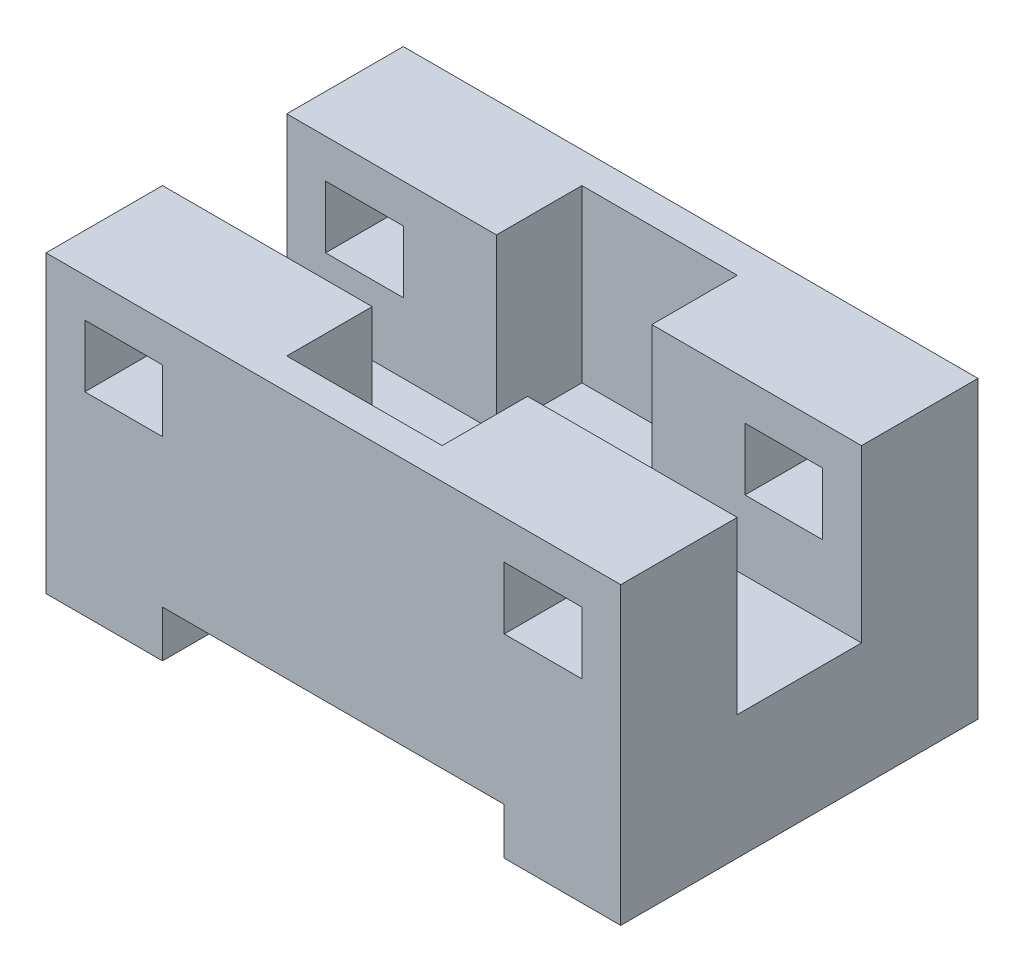
ISO-10303-21;
HEADER;
FILE_DESCRIPTION(('STEP AP214'),'2;1');
FILE_NAME('part.step','',(''),(''),'','','');
FILE_SCHEMA(('AUTOMOTIVE_DESIGN { 1 0 10303 214 1 1 1 1 }'));
ENDSEC;
DATA;
#1=APPLICATION_CONTEXT('core data for automotive mechanical design processes');
#2=APPLICATION_PROTOCOL_DEFINITION('international standard','automotive_design',2000,#1);
#3=PRODUCT_CONTEXT('',#1,'mechanical');
#4=PRODUCT('Part','Part','',(#3));
#5=PRODUCT_RELATED_PRODUCT_CATEGORY('part','',(#4));
#6=PRODUCT_DEFINITION_FORMATION('','',#4);
#7=PRODUCT_DEFINITION_CONTEXT('part definition',#1,'design');
#8=PRODUCT_DEFINITION('design','',#6,#7);
#9=PRODUCT_DEFINITION_SHAPE('','',#8);
#10=(LENGTH_UNIT() NAMED_UNIT(*) SI_UNIT(.MILLI.,.METRE.));
#11=(NAMED_UNIT(*) PLANE_ANGLE_UNIT() SI_UNIT($,.RADIAN.));
#12=(NAMED_UNIT(*) SI_UNIT($,.STERADIAN.) SOLID_ANGLE_UNIT());
#13=UNCERTAINTY_MEASURE_WITH_UNIT(LENGTH_MEASURE(1.E-05),#10,'distance_accuracy_value','');
#14=(GEOMETRIC_REPRESENTATION_CONTEXT(3) GLOBAL_UNCERTAINTY_ASSIGNED_CONTEXT((#13)) GLOBAL_UNIT_ASSIGNED_CONTEXT((#10,
#11,#12)) REPRESENTATION_CONTEXT('',''));
#15=CARTESIAN_POINT('',(0.,0.,0.));
#16=DIRECTION('',(0.,0.,1.));
#17=DIRECTION('',(1.,0.,0.));
#18=AXIS2_PLACEMENT_3D('',#15,#16,#17);
#19=CARTESIAN_POINT('',(-37.,32.,-46.));
#20=DIRECTION('',(0.,1.,0.));
#21=DIRECTION('',(0.,0.,1.));
#22=AXIS2_PLACEMENT_3D('',#19,#20,#21);
#23=PLANE('',#22);
#24=DIRECTION('',(0.,0.,1.));
#25=VECTOR('',#24,1.);
#26=CARTESIAN_POINT('',(-37.,32.,-46.));
#27=LINE('',#26,#25);
#28=CARTESIAN_POINT('',(-37.,32.,-46.));
#29=VERTEX_POINT('',#28);
#30=CARTESIAN_POINT('',(-37.,32.,-31.));
#31=VERTEX_POINT('',#30);
#32=EDGE_CURVE('E507',#29,#31,#27,.T.);
#33=ORIENTED_EDGE('',*,*,#32,.T.);
#34=DIRECTION('',(1.,0.,0.));
#35=VECTOR('',#34,1.);
#36=CARTESIAN_POINT('',(0.,32.,-31.));
#37=LINE('',#36,#35);
#38=CARTESIAN_POINT('',(-10.,32.,-31.));
#39=VERTEX_POINT('',#38);
#40=EDGE_CURVE('E422',#31,#39,#37,.T.);
#41=ORIENTED_EDGE('',*,*,#40,.T.);
#42=DIRECTION('',(0.,0.,1.));
#43=VECTOR('',#42,1.);
#44=CARTESIAN_POINT('',(-9.99999999999999,32.,0.));
#45=LINE('',#44,#43);
#46=CARTESIAN_POINT('',(-10.,32.,-42.));
#47=VERTEX_POINT('',#46);
#48=EDGE_CURVE('E419',#47,#39,#45,.T.);
#49=ORIENTED_EDGE('',*,*,#48,.F.);
#50=DIRECTION('',(1.,0.,0.));
#51=VECTOR('',#50,1.);
#52=CARTESIAN_POINT('',(0.,32.,-42.));
#53=LINE('',#52,#51);
#54=CARTESIAN_POINT('',(10.,32.,-42.));
#55=VERTEX_POINT('',#54);
#56=EDGE_CURVE('E416',#47,#55,#53,.T.);
#57=ORIENTED_EDGE('',*,*,#56,.T.);
#58=DIRECTION('',(0.,0.,1.));
#59=VECTOR('',#58,1.);
#60=CARTESIAN_POINT('',(9.99999999999998,32.,0.));
#61=LINE('',#60,#59);
#62=CARTESIAN_POINT('',(9.99999999999999,32.,-31.));
#63=VERTEX_POINT('',#62);
#64=EDGE_CURVE('E413',#55,#63,#61,.T.);
#65=ORIENTED_EDGE('',*,*,#64,.T.);
#66=DIRECTION('',(1.,0.,0.));
#67=VECTOR('',#66,1.);
#68=CARTESIAN_POINT('',(0.,32.,-31.));
#69=LINE('',#68,#67);
#70=CARTESIAN_POINT('',(37.,32.,-31.));
#71=VERTEX_POINT('',#70);
#72=EDGE_CURVE('E410',#63,#71,#69,.T.);
#73=ORIENTED_EDGE('',*,*,#72,.T.);
#74=DIRECTION('',(0.,0.,1.));
#75=VECTOR('',#74,1.);
#76=CARTESIAN_POINT('',(37.,32.,-46.));
#77=LINE('',#76,#75);
#78=CARTESIAN_POINT('',(37.,32.,-46.));
#79=VERTEX_POINT('',#78);
#80=EDGE_CURVE('E512',#79,#71,#77,.T.);
#81=ORIENTED_EDGE('',*,*,#80,.F.);
#82=DIRECTION('',(-1.,0.,0.));
#83=VECTOR('',#82,1.);
#84=CARTESIAN_POINT('',(-37.,32.,-46.));
#85=LINE('',#84,#83);
#86=EDGE_CURVE('E481',#79,#29,#85,.T.);
#87=ORIENTED_EDGE('',*,*,#86,.T.);
#88=EDGE_LOOP('',(#33,#41,#49,#57,#65,#73,#81,#87));
#89=FACE_BOUND('',#88,.T.);
#90=ADVANCED_FACE('F37',(#89),#23,.T.);
#91=CARTESIAN_POINT('',(37.,32.,-46.));
#92=DIRECTION('',(1.,0.,0.));
#93=DIRECTION('',(0.,0.,-1.));
#94=AXIS2_PLACEMENT_3D('',#91,#92,#93);
#95=PLANE('',#94);
#96=ORIENTED_EDGE('',*,*,#80,.T.);
#97=DIRECTION('',(0.,1.,0.));
#98=VECTOR('',#97,1.);
#99=CARTESIAN_POINT('',(37.,10.,-31.));
#100=LINE('',#99,#98);
#101=CARTESIAN_POINT('',(37.,10.,-31.));
#102=VERTEX_POINT('',#101);
#103=EDGE_CURVE('E453',#102,#71,#100,.T.);
#104=ORIENTED_EDGE('',*,*,#103,.F.);
#105=DIRECTION('',(0.,0.,-1.));
#106=VECTOR('',#105,1.);
#107=CARTESIAN_POINT('',(37.,10.,0.));
#108=LINE('',#107,#106);
#109=CARTESIAN_POINT('',(37.,10.,-15.));
#110=VERTEX_POINT('',#109);
#111=EDGE_CURVE('E379',#110,#102,#108,.T.);
#112=ORIENTED_EDGE('',*,*,#111,.F.);
#113=DIRECTION('',(0.,1.,0.));
#114=VECTOR('',#113,1.);
#115=CARTESIAN_POINT('',(37.,10.,-15.));
#116=LINE('',#115,#114);
#117=CARTESIAN_POINT('',(37.,32.,-15.));
#118=VERTEX_POINT('',#117);
#119=EDGE_CURVE('E455',#110,#118,#116,.T.);
#120=ORIENTED_EDGE('',*,*,#119,.T.);
#121=CARTESIAN_POINT('',(37.,32.,0.));
#122=VERTEX_POINT('',#121);
#123=EDGE_CURVE('E515',#118,#122,#77,.T.);
#124=ORIENTED_EDGE('',*,*,#123,.T.);
#125=DIRECTION('',(0.,1.,0.));
#126=VECTOR('',#125,1.);
#127=CARTESIAN_POINT('',(37.,32.,0.));
#128=LINE('',#127,#126);
#129=CARTESIAN_POINT('',(37.,-5.99999999999999,0.));
#130=VERTEX_POINT('',#129);
#131=EDGE_CURVE('E502',#130,#122,#128,.T.);
#132=ORIENTED_EDGE('',*,*,#131,.F.);
#133=DIRECTION('',(0.,0.,1.));
#134=VECTOR('',#133,1.);
#135=CARTESIAN_POINT('',(37.,-5.99999999999999,-46.));
#136=LINE('',#135,#134);
#137=CARTESIAN_POINT('',(37.,-5.99999999999999,-46.));
#138=VERTEX_POINT('',#137);
#139=EDGE_CURVE('E516',#138,#130,#136,.T.);
#140=ORIENTED_EDGE('',*,*,#139,.F.);
#141=DIRECTION('',(0.,1.,0.));
#142=VECTOR('',#141,1.);
#143=CARTESIAN_POINT('',(37.,32.,-46.));
#144=LINE('',#143,#142);
#145=EDGE_CURVE('E478',#138,#79,#144,.T.);
#146=ORIENTED_EDGE('',*,*,#145,.T.);
#147=EDGE_LOOP('',(#96,#104,#112,#120,#124,#132,#140,#146));
#148=FACE_BOUND('',#147,.T.);
#149=ADVANCED_FACE('F564',(#148),#95,.T.);
#150=CARTESIAN_POINT('',(-37.,32.,-46.));
#151=DIRECTION('',(-1.,0.,0.));
#152=DIRECTION('',(0.,-1.,0.));
#153=AXIS2_PLACEMENT_3D('',#150,#151,#152);
#154=PLANE('',#153);
#155=DIRECTION('',(0.,1.,0.));
#156=VECTOR('',#155,1.);
#157=CARTESIAN_POINT('',(-37.,10.,-15.));
#158=LINE('',#157,#156);
#159=CARTESIAN_POINT('',(-37.,10.,-15.));
#160=VERTEX_POINT('',#159);
#161=CARTESIAN_POINT('',(-37.,32.,-15.));
#162=VERTEX_POINT('',#161);
#163=EDGE_CURVE('E440',#160,#162,#158,.T.);
#164=ORIENTED_EDGE('',*,*,#163,.F.);
#165=DIRECTION('',(0.,0.,1.));
#166=VECTOR('',#165,1.);
#167=CARTESIAN_POINT('',(-37.,10.,0.));
#168=LINE('',#167,#166);
#169=CARTESIAN_POINT('',(-37.,10.,-31.));
#170=VERTEX_POINT('',#169);
#171=EDGE_CURVE('E393',#170,#160,#168,.T.);
#172=ORIENTED_EDGE('',*,*,#171,.F.);
#173=DIRECTION('',(0.,1.,0.));
#174=VECTOR('',#173,1.);
#175=CARTESIAN_POINT('',(-37.,10.,-31.));
#176=LINE('',#175,#174);
#177=EDGE_CURVE('E442',#170,#31,#176,.T.);
#178=ORIENTED_EDGE('',*,*,#177,.T.);
#179=ORIENTED_EDGE('',*,*,#32,.F.);
#180=DIRECTION('',(0.,-1.,0.));
#181=VECTOR('',#180,1.);
#182=CARTESIAN_POINT('',(-37.,32.,-46.));
#183=LINE('',#182,#181);
#184=CARTESIAN_POINT('',(-37.,-5.99999999999999,-46.));
#185=VERTEX_POINT('',#184);
#186=EDGE_CURVE('E459',#29,#185,#183,.T.);
#187=ORIENTED_EDGE('',*,*,#186,.T.);
#188=DIRECTION('',(0.,0.,1.));
#189=VECTOR('',#188,1.);
#190=CARTESIAN_POINT('',(-37.,-5.99999999999999,-46.));
#191=LINE('',#190,#189);
#192=CARTESIAN_POINT('',(-37.,-5.99999999999999,0.));
#193=VERTEX_POINT('',#192);
#194=EDGE_CURVE('E484',#185,#193,#191,.T.);
#195=ORIENTED_EDGE('',*,*,#194,.T.);
#196=DIRECTION('',(0.,-1.,0.));
#197=VECTOR('',#196,1.);
#198=CARTESIAN_POINT('',(-37.,32.,0.));
#199=LINE('',#198,#197);
#200=CARTESIAN_POINT('',(-37.,32.,0.));
#201=VERTEX_POINT('',#200);
#202=EDGE_CURVE('E435',#201,#193,#199,.T.);
#203=ORIENTED_EDGE('',*,*,#202,.F.);
#204=EDGE_CURVE('E511',#162,#201,#27,.T.);
#205=ORIENTED_EDGE('',*,*,#204,.F.);
#206=EDGE_LOOP('',(#164,#172,#178,#179,#187,#195,#203,#205));
#207=FACE_BOUND('',#206,.T.);
#208=ADVANCED_FACE('F39',(#207),#154,.T.);
#209=DIRECTION('',(1.,0.,0.));
#210=VECTOR('',#209,1.);
#211=CARTESIAN_POINT('',(0.,32.,-15.));
#212=LINE('',#211,#210);
#213=CARTESIAN_POINT('',(-10.,32.,-15.));
#214=VERTEX_POINT('',#213);
#215=EDGE_CURVE('E425',#162,#214,#212,.T.);
#216=ORIENTED_EDGE('',*,*,#215,.F.);
#217=ORIENTED_EDGE('',*,*,#204,.T.);
#218=DIRECTION('',(-1.,0.,0.));
#219=VECTOR('',#218,1.);
#220=CARTESIAN_POINT('',(-37.,32.,0.));
#221=LINE('',#220,#219);
#222=EDGE_CURVE('E463',#122,#201,#221,.T.);
#223=ORIENTED_EDGE('',*,*,#222,.F.);
#224=ORIENTED_EDGE('',*,*,#123,.F.);
#225=DIRECTION('',(1.,0.,0.));
#226=VECTOR('',#225,1.);
#227=CARTESIAN_POINT('',(0.,32.,-15.));
#228=LINE('',#227,#226);
#229=CARTESIAN_POINT('',(9.99999999999999,32.,-15.));
#230=VERTEX_POINT('',#229);
#231=EDGE_CURVE('E408',#230,#118,#228,.T.);
#232=ORIENTED_EDGE('',*,*,#231,.F.);
#233=DIRECTION('',(0.,0.,1.));
#234=VECTOR('',#233,1.);
#235=CARTESIAN_POINT('',(10.,32.,0.));
#236=LINE('',#235,#234);
#237=CARTESIAN_POINT('',(10.,32.,-4.));
#238=VERTEX_POINT('',#237);
#239=EDGE_CURVE('E373',#230,#238,#236,.T.);
#240=ORIENTED_EDGE('',*,*,#239,.T.);
#241=DIRECTION('',(1.,0.,0.));
#242=VECTOR('',#241,1.);
#243=CARTESIAN_POINT('',(0.,32.,-4.));
#244=LINE('',#243,#242);
#245=CARTESIAN_POINT('',(-10.,32.,-4.));
#246=VERTEX_POINT('',#245);
#247=EDGE_CURVE('E377',#246,#238,#244,.T.);
#248=ORIENTED_EDGE('',*,*,#247,.F.);
#249=DIRECTION('',(0.,0.,1.));
#250=VECTOR('',#249,1.);
#251=CARTESIAN_POINT('',(-10.,32.,0.));
#252=LINE('',#251,#250);
#253=EDGE_CURVE('E428',#214,#246,#252,.T.);
#254=ORIENTED_EDGE('',*,*,#253,.F.);
#255=EDGE_LOOP('',(#216,#217,#223,#224,#232,#240,#248,#254));
#256=FACE_BOUND('',#255,.T.);
#257=ADVANCED_FACE('F567',(#256),#23,.T.);
#258=CARTESIAN_POINT('',(22.,-5.99999999999999,-46.));
#259=DIRECTION('',(0.,-1.,0.));
#260=DIRECTION('',(1.,0.,0.));
#261=AXIS2_PLACEMENT_3D('',#258,#259,#260);
#262=PLANE('',#261);
#263=DIRECTION('',(1.,0.,0.));
#264=VECTOR('',#263,1.);
#265=CARTESIAN_POINT('',(22.,-5.99999999999999,0.));
#266=LINE('',#265,#264);
#267=CARTESIAN_POINT('',(22.,-5.99999999999999,0.));
#268=VERTEX_POINT('',#267);
#269=EDGE_CURVE('E499',#268,#130,#266,.T.);
#270=ORIENTED_EDGE('',*,*,#269,.F.);
#271=DIRECTION('',(0.,0.,1.));
#272=VECTOR('',#271,1.);
#273=CARTESIAN_POINT('',(22.,-5.99999999999999,-46.));
#274=LINE('',#273,#272);
#275=CARTESIAN_POINT('',(22.,-5.99999999999999,-46.));
#276=VERTEX_POINT('',#275);
#277=EDGE_CURVE('E518',#276,#268,#274,.T.);
#278=ORIENTED_EDGE('',*,*,#277,.F.);
#279=DIRECTION('',(1.,0.,0.));
#280=VECTOR('',#279,1.);
#281=CARTESIAN_POINT('',(22.,-5.99999999999999,-46.));
#282=LINE('',#281,#280);
#283=EDGE_CURVE('E475',#276,#138,#282,.T.);
#284=ORIENTED_EDGE('',*,*,#283,.T.);
#285=ORIENTED_EDGE('',*,*,#139,.T.);
#286=EDGE_LOOP('',(#270,#278,#284,#285));
#287=FACE_BOUND('',#286,.T.);
#288=ADVANCED_FACE('F575',(#287),#262,.T.);
#289=CARTESIAN_POINT('',(22.,-5.99999999999999,-46.));
#290=DIRECTION('',(-1.,0.,0.));
#291=DIRECTION('',(0.,0.,1.));
#292=AXIS2_PLACEMENT_3D('',#289,#290,#291);
#293=PLANE('',#292);
#294=DIRECTION('',(0.,-1.,0.));
#295=VECTOR('',#294,1.);
#296=CARTESIAN_POINT('',(22.,-5.99999999999999,0.));
#297=LINE('',#296,#295);
#298=CARTESIAN_POINT('',(22.,0.,0.));
#299=VERTEX_POINT('',#298);
#300=EDGE_CURVE('E496',#299,#268,#297,.T.);
#301=ORIENTED_EDGE('',*,*,#300,.F.);
#302=DIRECTION('',(0.,0.,1.));
#303=VECTOR('',#302,1.);
#304=CARTESIAN_POINT('',(22.,0.,-46.));
#305=LINE('',#304,#303);
#306=CARTESIAN_POINT('',(22.,0.,-46.));
#307=VERTEX_POINT('',#306);
#308=EDGE_CURVE('E520',#307,#299,#305,.T.);
#309=ORIENTED_EDGE('',*,*,#308,.F.);
#310=DIRECTION('',(0.,-1.,0.));
#311=VECTOR('',#310,1.);
#312=CARTESIAN_POINT('',(22.,-5.99999999999999,-46.));
#313=LINE('',#312,#311);
#314=EDGE_CURVE('E472',#307,#276,#313,.T.);
#315=ORIENTED_EDGE('',*,*,#314,.T.);
#316=ORIENTED_EDGE('',*,*,#277,.T.);
#317=EDGE_LOOP('',(#301,#309,#315,#316));
#318=FACE_BOUND('',#317,.T.);
#319=ADVANCED_FACE('F581',(#318),#293,.T.);
#320=CARTESIAN_POINT('',(-22.,0.,-46.));
#321=DIRECTION('',(0.,-1.,0.));
#322=DIRECTION('',(0.,0.,-1.));
#323=AXIS2_PLACEMENT_3D('',#320,#321,#322);
#324=PLANE('',#323);
#325=DIRECTION('',(1.,0.,0.));
#326=VECTOR('',#325,1.);
#327=CARTESIAN_POINT('',(-22.,0.,0.));
#328=LINE('',#327,#326);
#329=CARTESIAN_POINT('',(-22.,0.,0.));
#330=VERTEX_POINT('',#329);
#331=EDGE_CURVE('E493',#330,#299,#328,.T.);
#332=ORIENTED_EDGE('',*,*,#331,.F.);
#333=DIRECTION('',(0.,0.,1.));
#334=VECTOR('',#333,1.);
#335=CARTESIAN_POINT('',(-22.,0.,-46.));
#336=LINE('',#335,#334);
#337=CARTESIAN_POINT('',(-22.,0.,-46.));
#338=VERTEX_POINT('',#337);
#339=EDGE_CURVE('E522',#338,#330,#336,.T.);
#340=ORIENTED_EDGE('',*,*,#339,.F.);
#341=DIRECTION('',(1.,0.,0.));
#342=VECTOR('',#341,1.);
#343=CARTESIAN_POINT('',(-22.,0.,-46.));
#344=LINE('',#343,#342);
#345=EDGE_CURVE('E469',#338,#307,#344,.T.);
#346=ORIENTED_EDGE('',*,*,#345,.T.);
#347=ORIENTED_EDGE('',*,*,#308,.T.);
#348=EDGE_LOOP('',(#332,#340,#346,#347));
#349=FACE_BOUND('',#348,.T.);
#350=ADVANCED_FACE('F637',(#349),#324,.T.);
#351=CARTESIAN_POINT('',(-22.,-5.99999999999999,-46.));
#352=DIRECTION('',(1.,0.,0.));
#353=DIRECTION('',(0.,0.,-1.));
#354=AXIS2_PLACEMENT_3D('',#351,#352,#353);
#355=PLANE('',#354);
#356=DIRECTION('',(0.,1.,0.));
#357=VECTOR('',#356,1.);
#358=CARTESIAN_POINT('',(-22.,-5.99999999999999,0.));
#359=LINE('',#358,#357);
#360=CARTESIAN_POINT('',(-22.,-5.99999999999999,0.));
#361=VERTEX_POINT('',#360);
#362=EDGE_CURVE('E490',#361,#330,#359,.T.);
#363=ORIENTED_EDGE('',*,*,#362,.F.);
#364=DIRECTION('',(0.,0.,1.));
#365=VECTOR('',#364,1.);
#366=CARTESIAN_POINT('',(-22.,-5.99999999999999,-46.));
#367=LINE('',#366,#365);
#368=CARTESIAN_POINT('',(-22.,-5.99999999999999,-46.));
#369=VERTEX_POINT('',#368);
#370=EDGE_CURVE('E524',#369,#361,#367,.T.);
#371=ORIENTED_EDGE('',*,*,#370,.F.);
#372=DIRECTION('',(0.,1.,0.));
#373=VECTOR('',#372,1.);
#374=CARTESIAN_POINT('',(-22.,-5.99999999999999,-46.));
#375=LINE('',#374,#373);
#376=EDGE_CURVE('E466',#369,#338,#375,.T.);
#377=ORIENTED_EDGE('',*,*,#376,.T.);
#378=ORIENTED_EDGE('',*,*,#339,.T.);
#379=EDGE_LOOP('',(#363,#371,#377,#378));
#380=FACE_BOUND('',#379,.T.);
#381=ADVANCED_FACE('F635',(#380),#355,.T.);
#382=CARTESIAN_POINT('',(-37.,-5.99999999999999,-46.));
#383=DIRECTION('',(0.,-1.,0.));
#384=DIRECTION('',(0.,0.,-1.));
#385=AXIS2_PLACEMENT_3D('',#382,#383,#384);
#386=PLANE('',#385);
#387=DIRECTION('',(1.,0.,0.));
#388=VECTOR('',#387,1.);
#389=CARTESIAN_POINT('',(-37.,-5.99999999999999,0.));
#390=LINE('',#389,#388);
#391=EDGE_CURVE('E487',#193,#361,#390,.T.);
#392=ORIENTED_EDGE('',*,*,#391,.F.);
#393=ORIENTED_EDGE('',*,*,#194,.F.);
#394=DIRECTION('',(1.,0.,0.));
#395=VECTOR('',#394,1.);
#396=CARTESIAN_POINT('',(-37.,-5.99999999999999,-46.));
#397=LINE('',#396,#395);
#398=EDGE_CURVE('E462',#185,#369,#397,.T.);
#399=ORIENTED_EDGE('',*,*,#398,.T.);
#400=ORIENTED_EDGE('',*,*,#370,.T.);
#401=EDGE_LOOP('',(#392,#393,#399,#400));
#402=FACE_BOUND('',#401,.T.);
#403=ADVANCED_FACE('F631',(#402),#386,.T.);
#404=CARTESIAN_POINT('',(0.,0.,-46.));
#405=DIRECTION('',(0.,0.,1.));
#406=DIRECTION('',(1.,0.,0.));
#407=AXIS2_PLACEMENT_3D('',#404,#405,#406);
#408=PLANE('',#407);
#409=DIRECTION('',(-1.,0.,0.));
#410=VECTOR('',#409,1.);
#411=CARTESIAN_POINT('',(-32.,27.,-46.));
#412=LINE('',#411,#410);
#413=CARTESIAN_POINT('',(-22.,27.,-46.));
#414=VERTEX_POINT('',#413);
#415=CARTESIAN_POINT('',(-32.,27.,-46.));
#416=VERTEX_POINT('',#415);
#417=EDGE_CURVE('E293',#414,#416,#412,.T.);
#418=ORIENTED_EDGE('',*,*,#417,.T.);
#419=DIRECTION('',(0.,-1.,0.));
#420=VECTOR('',#419,1.);
#421=CARTESIAN_POINT('',(-32.,27.,-46.));
#422=LINE('',#421,#420);
#423=CARTESIAN_POINT('',(-32.,19.,-46.));
#424=VERTEX_POINT('',#423);
#425=EDGE_CURVE('E276',#416,#424,#422,.T.);
#426=ORIENTED_EDGE('',*,*,#425,.T.);
#427=DIRECTION('',(1.,0.,0.));
#428=VECTOR('',#427,1.);
#429=CARTESIAN_POINT('',(-32.,19.,-46.));
#430=LINE('',#429,#428);
#431=CARTESIAN_POINT('',(-22.,19.,-46.));
#432=VERTEX_POINT('',#431);
#433=EDGE_CURVE('E285',#424,#432,#430,.T.);
#434=ORIENTED_EDGE('',*,*,#433,.T.);
#435=DIRECTION('',(0.,1.,0.));
#436=VECTOR('',#435,1.);
#437=CARTESIAN_POINT('',(-22.,27.,-46.));
#438=LINE('',#437,#436);
#439=EDGE_CURVE('E52',#432,#414,#438,.T.);
#440=ORIENTED_EDGE('',*,*,#439,.T.);
#441=EDGE_LOOP('',(#418,#426,#434,#440));
#442=FACE_BOUND('',#441,.T.);
#443=DIRECTION('',(1.,0.,0.));
#444=VECTOR('',#443,1.);
#445=CARTESIAN_POINT('',(32.,19.,-46.));
#446=LINE('',#445,#444);
#447=CARTESIAN_POINT('',(22.,19.,-46.));
#448=VERTEX_POINT('',#447);
#449=CARTESIAN_POINT('',(32.,19.,-46.));
#450=VERTEX_POINT('',#449);
#451=EDGE_CURVE('E321',#448,#450,#446,.T.);
#452=ORIENTED_EDGE('',*,*,#451,.T.);
#453=DIRECTION('',(0.,1.,0.));
#454=VECTOR('',#453,1.);
#455=CARTESIAN_POINT('',(32.,27.,-46.));
#456=LINE('',#455,#454);
#457=CARTESIAN_POINT('',(32.,27.,-46.));
#458=VERTEX_POINT('',#457);
#459=EDGE_CURVE('E338',#450,#458,#456,.T.);
#460=ORIENTED_EDGE('',*,*,#459,.T.);
#461=DIRECTION('',(-1.,0.,0.));
#462=VECTOR('',#461,1.);
#463=CARTESIAN_POINT('',(32.,27.,-46.));
#464=LINE('',#463,#462);
#465=CARTESIAN_POINT('',(22.,27.,-46.));
#466=VERTEX_POINT('',#465);
#467=EDGE_CURVE('E348',#458,#466,#464,.T.);
#468=ORIENTED_EDGE('',*,*,#467,.T.);
#469=DIRECTION('',(0.,-1.,0.));
#470=VECTOR('',#469,1.);
#471=CARTESIAN_POINT('',(22.,27.,-46.));
#472=LINE('',#471,#470);
#473=EDGE_CURVE('E60',#466,#448,#472,.T.);
#474=ORIENTED_EDGE('',*,*,#473,.T.);
#475=EDGE_LOOP('',(#452,#460,#468,#474));
#476=FACE_BOUND('',#475,.T.);
#477=ORIENTED_EDGE('',*,*,#186,.F.);
#478=ORIENTED_EDGE('',*,*,#86,.F.);
#479=ORIENTED_EDGE('',*,*,#145,.F.);
#480=ORIENTED_EDGE('',*,*,#283,.F.);
#481=ORIENTED_EDGE('',*,*,#314,.F.);
#482=ORIENTED_EDGE('',*,*,#345,.F.);
#483=ORIENTED_EDGE('',*,*,#376,.F.);
#484=ORIENTED_EDGE('',*,*,#398,.F.);
#485=EDGE_LOOP('',(#477,#478,#479,#480,#481,#482,#483,#484));
#486=FACE_BOUND('',#485,.T.);
#487=ADVANCED_FACE('F290',(#442,#476,#486),#408,.F.);
#488=CARTESIAN_POINT('',(0.,0.,0.));
#489=DIRECTION('',(0.,0.,1.));
#490=DIRECTION('',(1.,0.,0.));
#491=AXIS2_PLACEMENT_3D('',#488,#489,#490);
#492=PLANE('',#491);
#493=DIRECTION('',(0.,-1.,0.));
#494=VECTOR('',#493,1.);
#495=CARTESIAN_POINT('',(-32.,27.,0.));
#496=LINE('',#495,#494);
#497=CARTESIAN_POINT('',(-32.,27.,0.));
#498=VERTEX_POINT('',#497);
#499=CARTESIAN_POINT('',(-32.,19.,0.));
#500=VERTEX_POINT('',#499);
#501=EDGE_CURVE('E302',#498,#500,#496,.T.);
#502=ORIENTED_EDGE('',*,*,#501,.F.);
#503=DIRECTION('',(-1.,0.,0.));
#504=VECTOR('',#503,1.);
#505=CARTESIAN_POINT('',(-32.,27.,0.));
#506=LINE('',#505,#504);
#507=CARTESIAN_POINT('',(-22.,27.,0.));
#508=VERTEX_POINT('',#507);
#509=EDGE_CURVE('E294',#508,#498,#506,.T.);
#510=ORIENTED_EDGE('',*,*,#509,.F.);
#511=DIRECTION('',(0.,1.,0.));
#512=VECTOR('',#511,1.);
#513=CARTESIAN_POINT('',(-22.,27.,0.));
#514=LINE('',#513,#512);
#515=CARTESIAN_POINT('',(-22.,19.,0.));
#516=VERTEX_POINT('',#515);
#517=EDGE_CURVE('E297',#516,#508,#514,.T.);
#518=ORIENTED_EDGE('',*,*,#517,.F.);
#519=DIRECTION('',(1.,0.,0.));
#520=VECTOR('',#519,1.);
#521=CARTESIAN_POINT('',(-32.,19.,0.));
#522=LINE('',#521,#520);
#523=EDGE_CURVE('E304',#500,#516,#522,.T.);
#524=ORIENTED_EDGE('',*,*,#523,.F.);
#525=EDGE_LOOP('',(#502,#510,#518,#524));
#526=FACE_BOUND('',#525,.T.);
#527=DIRECTION('',(0.,1.,0.));
#528=VECTOR('',#527,1.);
#529=CARTESIAN_POINT('',(32.,27.,0.));
#530=LINE('',#529,#528);
#531=CARTESIAN_POINT('',(32.,19.,0.));
#532=VERTEX_POINT('',#531);
#533=CARTESIAN_POINT('',(32.,27.,0.));
#534=VERTEX_POINT('',#533);
#535=EDGE_CURVE('E305',#532,#534,#530,.T.);
#536=ORIENTED_EDGE('',*,*,#535,.F.);
#537=DIRECTION('',(1.,0.,0.));
#538=VECTOR('',#537,1.);
#539=CARTESIAN_POINT('',(32.,19.,0.));
#540=LINE('',#539,#538);
#541=CARTESIAN_POINT('',(22.,19.,0.));
#542=VERTEX_POINT('',#541);
#543=EDGE_CURVE('E334',#542,#532,#540,.T.);
#544=ORIENTED_EDGE('',*,*,#543,.F.);
#545=DIRECTION('',(0.,-1.,0.));
#546=VECTOR('',#545,1.);
#547=CARTESIAN_POINT('',(22.,27.,0.));
#548=LINE('',#547,#546);
#549=CARTESIAN_POINT('',(22.,27.,0.));
#550=VERTEX_POINT('',#549);
#551=EDGE_CURVE('E337',#550,#542,#548,.T.);
#552=ORIENTED_EDGE('',*,*,#551,.F.);
#553=DIRECTION('',(-1.,0.,0.));
#554=VECTOR('',#553,1.);
#555=CARTESIAN_POINT('',(32.,27.,0.));
#556=LINE('',#555,#554);
#557=EDGE_CURVE('E341',#534,#550,#556,.T.);
#558=ORIENTED_EDGE('',*,*,#557,.F.);
#559=EDGE_LOOP('',(#536,#544,#552,#558));
#560=FACE_BOUND('',#559,.T.);
#561=ORIENTED_EDGE('',*,*,#202,.T.);
#562=ORIENTED_EDGE('',*,*,#391,.T.);
#563=ORIENTED_EDGE('',*,*,#362,.T.);
#564=ORIENTED_EDGE('',*,*,#331,.T.);
#565=ORIENTED_EDGE('',*,*,#300,.T.);
#566=ORIENTED_EDGE('',*,*,#269,.T.);
#567=ORIENTED_EDGE('',*,*,#131,.T.);
#568=ORIENTED_EDGE('',*,*,#222,.T.);
#569=EDGE_LOOP('',(#561,#562,#563,#564,#565,#566,#567,#568));
#570=FACE_BOUND('',#569,.T.);
#571=ADVANCED_FACE('F596',(#526,#560,#570),#492,.T.);
#572=CARTESIAN_POINT('',(10.,10.,0.));
#573=DIRECTION('',(-1.,0.,0.));
#574=DIRECTION('',(0.,0.,1.));
#575=AXIS2_PLACEMENT_3D('',#572,#573,#574);
#576=PLANE('',#575);
#577=ORIENTED_EDGE('',*,*,#239,.F.);
#578=DIRECTION('',(0.,1.,0.));
#579=VECTOR('',#578,1.);
#580=CARTESIAN_POINT('',(10.,10.,-15.));
#581=LINE('',#580,#579);
#582=CARTESIAN_POINT('',(10.,10.,-15.));
#583=VERTEX_POINT('',#582);
#584=EDGE_CURVE('E405',#583,#230,#581,.T.);
#585=ORIENTED_EDGE('',*,*,#584,.F.);
#586=DIRECTION('',(0.,0.,1.));
#587=VECTOR('',#586,1.);
#588=CARTESIAN_POINT('',(10.,10.,0.));
#589=LINE('',#588,#587);
#590=CARTESIAN_POINT('',(10.,10.,-4.));
#591=VERTEX_POINT('',#590);
#592=EDGE_CURVE('E374',#583,#591,#589,.T.);
#593=ORIENTED_EDGE('',*,*,#592,.T.);
#594=DIRECTION('',(0.,1.,0.));
#595=VECTOR('',#594,1.);
#596=CARTESIAN_POINT('',(10.,10.,-4.));
#597=LINE('',#596,#595);
#598=EDGE_CURVE('E433',#591,#238,#597,.T.);
#599=ORIENTED_EDGE('',*,*,#598,.T.);
#600=EDGE_LOOP('',(#577,#585,#593,#599));
#601=FACE_BOUND('',#600,.T.);
#602=ADVANCED_FACE('F609',(#601),#576,.T.);
#603=CARTESIAN_POINT('',(0.,10.,-4.));
#604=DIRECTION('',(0.,0.,1.));
#605=DIRECTION('',(1.,0.,0.));
#606=AXIS2_PLACEMENT_3D('',#603,#604,#605);
#607=PLANE('',#606);
#608=ORIENTED_EDGE('',*,*,#247,.T.);
#609=ORIENTED_EDGE('',*,*,#598,.F.);
#610=DIRECTION('',(1.,0.,0.));
#611=VECTOR('',#610,1.);
#612=CARTESIAN_POINT('',(0.,10.,-4.));
#613=LINE('',#612,#611);
#614=CARTESIAN_POINT('',(-9.99999999999999,10.,-4.));
#615=VERTEX_POINT('',#614);
#616=EDGE_CURVE('E402',#615,#591,#613,.T.);
#617=ORIENTED_EDGE('',*,*,#616,.F.);
#618=DIRECTION('',(0.,1.,0.));
#619=VECTOR('',#618,1.);
#620=CARTESIAN_POINT('',(-9.99999999999999,10.,-4.));
#621=LINE('',#620,#619);
#622=EDGE_CURVE('E436',#615,#246,#621,.T.);
#623=ORIENTED_EDGE('',*,*,#622,.T.);
#624=EDGE_LOOP('',(#608,#609,#617,#623));
#625=FACE_BOUND('',#624,.T.);
#626=ADVANCED_FACE('F612',(#625),#607,.F.);
#627=CARTESIAN_POINT('',(-9.99999999999999,10.,0.));
#628=DIRECTION('',(-1.,0.,0.));
#629=DIRECTION('',(0.,-1.,0.));
#630=AXIS2_PLACEMENT_3D('',#627,#628,#629);
#631=PLANE('',#630);
#632=ORIENTED_EDGE('',*,*,#253,.T.);
#633=ORIENTED_EDGE('',*,*,#622,.F.);
#634=DIRECTION('',(0.,0.,1.));
#635=VECTOR('',#634,1.);
#636=CARTESIAN_POINT('',(-9.99999999999999,10.,0.));
#637=LINE('',#636,#635);
#638=CARTESIAN_POINT('',(-9.99999999999999,10.,-15.));
#639=VERTEX_POINT('',#638);
#640=EDGE_CURVE('E399',#639,#615,#637,.T.);
#641=ORIENTED_EDGE('',*,*,#640,.F.);
#642=DIRECTION('',(0.,1.,0.));
#643=VECTOR('',#642,1.);
#644=CARTESIAN_POINT('',(-9.99999999999999,10.,-15.));
#645=LINE('',#644,#643);
#646=EDGE_CURVE('E438',#639,#214,#645,.T.);
#647=ORIENTED_EDGE('',*,*,#646,.T.);
#648=EDGE_LOOP('',(#632,#633,#641,#647));
#649=FACE_BOUND('',#648,.T.);
#650=ADVANCED_FACE('F616',(#649),#631,.F.);
#651=CARTESIAN_POINT('',(0.,10.,-15.));
#652=DIRECTION('',(0.,0.,1.));
#653=DIRECTION('',(1.,0.,0.));
#654=AXIS2_PLACEMENT_3D('',#651,#652,#653);
#655=PLANE('',#654);
#656=DIRECTION('',(-1.,0.,0.));
#657=VECTOR('',#656,1.);
#658=CARTESIAN_POINT('',(0.,27.,-15.));
#659=LINE('',#658,#657);
#660=CARTESIAN_POINT('',(-22.,27.,-15.));
#661=VERTEX_POINT('',#660);
#662=CARTESIAN_POINT('',(-32.,27.,-15.));
#663=VERTEX_POINT('',#662);
#664=EDGE_CURVE('E367',#661,#663,#659,.T.);
#665=ORIENTED_EDGE('',*,*,#664,.T.);
#666=DIRECTION('',(0.,-1.,0.));
#667=VECTOR('',#666,1.);
#668=CARTESIAN_POINT('',(-32.,10.,-15.));
#669=LINE('',#668,#667);
#670=CARTESIAN_POINT('',(-32.,19.,-15.));
#671=VERTEX_POINT('',#670);
#672=EDGE_CURVE('E370',#663,#671,#669,.T.);
#673=ORIENTED_EDGE('',*,*,#672,.T.);
#674=DIRECTION('',(1.,0.,0.));
#675=VECTOR('',#674,1.);
#676=CARTESIAN_POINT('',(0.,19.,-15.));
#677=LINE('',#676,#675);
#678=CARTESIAN_POINT('',(-22.,19.,-15.));
#679=VERTEX_POINT('',#678);
#680=EDGE_CURVE('E361',#671,#679,#677,.T.);
#681=ORIENTED_EDGE('',*,*,#680,.T.);
#682=DIRECTION('',(0.,1.,0.));
#683=VECTOR('',#682,1.);
#684=CARTESIAN_POINT('',(-22.,10.,-15.));
#685=LINE('',#684,#683);
#686=EDGE_CURVE('E364',#679,#661,#685,.T.);
#687=ORIENTED_EDGE('',*,*,#686,.T.);
#688=EDGE_LOOP('',(#665,#673,#681,#687));
#689=FACE_BOUND('',#688,.T.);
#690=ORIENTED_EDGE('',*,*,#215,.T.);
#691=ORIENTED_EDGE('',*,*,#646,.F.);
#692=DIRECTION('',(1.,0.,0.));
#693=VECTOR('',#692,1.);
#694=CARTESIAN_POINT('',(0.,10.,-15.));
#695=LINE('',#694,#693);
#696=EDGE_CURVE('E396',#160,#639,#695,.T.);
#697=ORIENTED_EDGE('',*,*,#696,.F.);
#698=ORIENTED_EDGE('',*,*,#163,.T.);
#699=EDGE_LOOP('',(#690,#691,#697,#698));
#700=FACE_BOUND('',#699,.T.);
#701=ADVANCED_FACE('F617',(#689,#700),#655,.F.);
#702=CARTESIAN_POINT('',(0.,10.,-31.));
#703=DIRECTION('',(0.,0.,1.));
#704=DIRECTION('',(1.,0.,0.));
#705=AXIS2_PLACEMENT_3D('',#702,#703,#704);
#706=PLANE('',#705);
#707=DIRECTION('',(0.,-1.,0.));
#708=VECTOR('',#707,1.);
#709=CARTESIAN_POINT('',(-32.,10.,-31.));
#710=LINE('',#709,#708);
#711=CARTESIAN_POINT('',(-32.,27.,-31.));
#712=VERTEX_POINT('',#711);
#713=CARTESIAN_POINT('',(-32.,19.,-31.));
#714=VERTEX_POINT('',#713);
#715=EDGE_CURVE('E11',#712,#714,#710,.T.);
#716=ORIENTED_EDGE('',*,*,#715,.F.);
#717=DIRECTION('',(-1.,0.,0.));
#718=VECTOR('',#717,1.);
#719=CARTESIAN_POINT('',(0.,27.,-31.));
#720=LINE('',#719,#718);
#721=CARTESIAN_POINT('',(-22.,27.,-31.));
#722=VERTEX_POINT('',#721);
#723=EDGE_CURVE('E45',#722,#712,#720,.T.);
#724=ORIENTED_EDGE('',*,*,#723,.F.);
#725=DIRECTION('',(0.,1.,0.));
#726=VECTOR('',#725,1.);
#727=CARTESIAN_POINT('',(-22.,10.,-31.));
#728=LINE('',#727,#726);
#729=CARTESIAN_POINT('',(-22.,19.,-31.));
#730=VERTEX_POINT('',#729);
#731=EDGE_CURVE('E540',#730,#722,#728,.T.);
#732=ORIENTED_EDGE('',*,*,#731,.F.);
#733=DIRECTION('',(1.,0.,0.));
#734=VECTOR('',#733,1.);
#735=CARTESIAN_POINT('',(0.,19.,-31.));
#736=LINE('',#735,#734);
#737=EDGE_CURVE('E538',#714,#730,#736,.T.);
#738=ORIENTED_EDGE('',*,*,#737,.F.);
#739=EDGE_LOOP('',(#716,#724,#732,#738));
#740=FACE_BOUND('',#739,.T.);
#741=ORIENTED_EDGE('',*,*,#40,.F.);
#742=ORIENTED_EDGE('',*,*,#177,.F.);
#743=DIRECTION('',(1.,0.,0.));
#744=VECTOR('',#743,1.);
#745=CARTESIAN_POINT('',(0.,10.,-31.));
#746=LINE('',#745,#744);
#747=CARTESIAN_POINT('',(-9.99999999999999,10.,-31.));
#748=VERTEX_POINT('',#747);
#749=EDGE_CURVE('E391',#170,#748,#746,.T.);
#750=ORIENTED_EDGE('',*,*,#749,.T.);
#751=DIRECTION('',(0.,1.,0.));
#752=VECTOR('',#751,1.);
#753=CARTESIAN_POINT('',(-9.99999999999999,10.,-31.));
#754=LINE('',#753,#752);
#755=EDGE_CURVE('E445',#748,#39,#754,.T.);
#756=ORIENTED_EDGE('',*,*,#755,.T.);
#757=EDGE_LOOP('',(#741,#742,#750,#756));
#758=FACE_BOUND('',#757,.T.);
#759=ADVANCED_FACE('F546',(#740,#758),#706,.T.);
#760=CARTESIAN_POINT('',(-9.99999999999998,10.,0.));
#761=DIRECTION('',(-1.,0.,0.));
#762=DIRECTION('',(0.,0.,1.));
#763=AXIS2_PLACEMENT_3D('',#760,#761,#762);
#764=PLANE('',#763);
#765=ORIENTED_EDGE('',*,*,#48,.T.);
#766=ORIENTED_EDGE('',*,*,#755,.F.);
#767=DIRECTION('',(0.,0.,1.));
#768=VECTOR('',#767,1.);
#769=CARTESIAN_POINT('',(-9.99999999999998,10.,0.));
#770=LINE('',#769,#768);
#771=CARTESIAN_POINT('',(-10.,10.,-42.));
#772=VERTEX_POINT('',#771);
#773=EDGE_CURVE('E388',#772,#748,#770,.T.);
#774=ORIENTED_EDGE('',*,*,#773,.F.);
#775=DIRECTION('',(0.,1.,0.));
#776=VECTOR('',#775,1.);
#777=CARTESIAN_POINT('',(-10.,10.,-42.));
#778=LINE('',#777,#776);
#779=EDGE_CURVE('E447',#772,#47,#778,.T.);
#780=ORIENTED_EDGE('',*,*,#779,.T.);
#781=EDGE_LOOP('',(#765,#766,#774,#780));
#782=FACE_BOUND('',#781,.T.);
#783=ADVANCED_FACE('F658',(#782),#764,.F.);
#784=CARTESIAN_POINT('',(0.,10.,-42.));
#785=DIRECTION('',(0.,0.,1.));
#786=DIRECTION('',(1.,0.,0.));
#787=AXIS2_PLACEMENT_3D('',#784,#785,#786);
#788=PLANE('',#787);
#789=ORIENTED_EDGE('',*,*,#56,.F.);
#790=ORIENTED_EDGE('',*,*,#779,.F.);
#791=DIRECTION('',(1.,0.,0.));
#792=VECTOR('',#791,1.);
#793=CARTESIAN_POINT('',(0.,10.,-42.));
#794=LINE('',#793,#792);
#795=CARTESIAN_POINT('',(10.,10.,-42.));
#796=VERTEX_POINT('',#795);
#797=EDGE_CURVE('E386',#772,#796,#794,.T.);
#798=ORIENTED_EDGE('',*,*,#797,.T.);
#799=DIRECTION('',(0.,1.,0.));
#800=VECTOR('',#799,1.);
#801=CARTESIAN_POINT('',(10.,10.,-42.));
#802=LINE('',#801,#800);
#803=EDGE_CURVE('E449',#796,#55,#802,.T.);
#804=ORIENTED_EDGE('',*,*,#803,.T.);
#805=EDGE_LOOP('',(#789,#790,#798,#804));
#806=FACE_BOUND('',#805,.T.);
#807=ADVANCED_FACE('F665',(#806),#788,.T.);
#808=CARTESIAN_POINT('',(9.99999999999998,10.,0.));
#809=DIRECTION('',(-1.,0.,0.));
#810=DIRECTION('',(0.,0.,1.));
#811=AXIS2_PLACEMENT_3D('',#808,#809,#810);
#812=PLANE('',#811);
#813=ORIENTED_EDGE('',*,*,#64,.F.);
#814=ORIENTED_EDGE('',*,*,#803,.F.);
#815=DIRECTION('',(0.,0.,1.));
#816=VECTOR('',#815,1.);
#817=CARTESIAN_POINT('',(9.99999999999998,10.,0.));
#818=LINE('',#817,#816);
#819=CARTESIAN_POINT('',(10.,10.,-31.));
#820=VERTEX_POINT('',#819);
#821=EDGE_CURVE('E384',#796,#820,#818,.T.);
#822=ORIENTED_EDGE('',*,*,#821,.T.);
#823=DIRECTION('',(0.,1.,0.));
#824=VECTOR('',#823,1.);
#825=CARTESIAN_POINT('',(10.,10.,-31.));
#826=LINE('',#825,#824);
#827=EDGE_CURVE('E451',#820,#63,#826,.T.);
#828=ORIENTED_EDGE('',*,*,#827,.T.);
#829=EDGE_LOOP('',(#813,#814,#822,#828));
#830=FACE_BOUND('',#829,.T.);
#831=ADVANCED_FACE('F651',(#830),#812,.T.);
#832=CARTESIAN_POINT('',(0.,10.,-31.));
#833=DIRECTION('',(0.,0.,1.));
#834=DIRECTION('',(1.,0.,0.));
#835=AXIS2_PLACEMENT_3D('',#832,#833,#834);
#836=PLANE('',#835);
#837=DIRECTION('',(0.,1.,0.));
#838=VECTOR('',#837,1.);
#839=CARTESIAN_POINT('',(32.,10.,-31.));
#840=LINE('',#839,#838);
#841=CARTESIAN_POINT('',(32.,19.,-31.));
#842=VERTEX_POINT('',#841);
#843=CARTESIAN_POINT('',(32.,27.,-31.));
#844=VERTEX_POINT('',#843);
#845=EDGE_CURVE('E358',#842,#844,#840,.T.);
#846=ORIENTED_EDGE('',*,*,#845,.F.);
#847=DIRECTION('',(1.,0.,0.));
#848=VECTOR('',#847,1.);
#849=CARTESIAN_POINT('',(0.,19.,-31.));
#850=LINE('',#849,#848);
#851=CARTESIAN_POINT('',(22.,19.,-31.));
#852=VERTEX_POINT('',#851);
#853=EDGE_CURVE('E356',#852,#842,#850,.T.);
#854=ORIENTED_EDGE('',*,*,#853,.F.);
#855=DIRECTION('',(0.,-1.,0.));
#856=VECTOR('',#855,1.);
#857=CARTESIAN_POINT('',(22.,10.,-31.));
#858=LINE('',#857,#856);
#859=CARTESIAN_POINT('',(22.,27.,-31.));
#860=VERTEX_POINT('',#859);
#861=EDGE_CURVE('E354',#860,#852,#858,.T.);
#862=ORIENTED_EDGE('',*,*,#861,.F.);
#863=DIRECTION('',(-1.,0.,0.));
#864=VECTOR('',#863,1.);
#865=CARTESIAN_POINT('',(0.,27.,-31.));
#866=LINE('',#865,#864);
#867=EDGE_CURVE('E312',#844,#860,#866,.T.);
#868=ORIENTED_EDGE('',*,*,#867,.F.);
#869=EDGE_LOOP('',(#846,#854,#862,#868));
#870=FACE_BOUND('',#869,.T.);
#871=ORIENTED_EDGE('',*,*,#72,.F.);
#872=ORIENTED_EDGE('',*,*,#827,.F.);
#873=DIRECTION('',(1.,0.,0.));
#874=VECTOR('',#873,1.);
#875=CARTESIAN_POINT('',(0.,10.,-31.));
#876=LINE('',#875,#874);
#877=EDGE_CURVE('E382',#820,#102,#876,.T.);
#878=ORIENTED_EDGE('',*,*,#877,.T.);
#879=ORIENTED_EDGE('',*,*,#103,.T.);
#880=EDGE_LOOP('',(#871,#872,#878,#879));
#881=FACE_BOUND('',#880,.T.);
#882=ADVANCED_FACE('F644',(#870,#881),#836,.T.);
#883=CARTESIAN_POINT('',(0.,10.,-15.));
#884=DIRECTION('',(0.,0.,1.));
#885=DIRECTION('',(1.,0.,0.));
#886=AXIS2_PLACEMENT_3D('',#883,#884,#885);
#887=PLANE('',#886);
#888=DIRECTION('',(1.,0.,0.));
#889=VECTOR('',#888,1.);
#890=CARTESIAN_POINT('',(0.,19.,-15.));
#891=LINE('',#890,#889);
#892=CARTESIAN_POINT('',(22.,19.,-15.));
#893=VERTEX_POINT('',#892);
#894=CARTESIAN_POINT('',(32.,19.,-15.));
#895=VERTEX_POINT('',#894);
#896=EDGE_CURVE('E532',#893,#895,#891,.T.);
#897=ORIENTED_EDGE('',*,*,#896,.T.);
#898=DIRECTION('',(0.,1.,0.));
#899=VECTOR('',#898,1.);
#900=CARTESIAN_POINT('',(32.,10.,-15.));
#901=LINE('',#900,#899);
#902=CARTESIAN_POINT('',(32.,27.,-15.));
#903=VERTEX_POINT('',#902);
#904=EDGE_CURVE('E535',#895,#903,#901,.T.);
#905=ORIENTED_EDGE('',*,*,#904,.T.);
#906=DIRECTION('',(-1.,0.,0.));
#907=VECTOR('',#906,1.);
#908=CARTESIAN_POINT('',(0.,27.,-15.));
#909=LINE('',#908,#907);
#910=CARTESIAN_POINT('',(22.,27.,-15.));
#911=VERTEX_POINT('',#910);
#912=EDGE_CURVE('E510',#903,#911,#909,.T.);
#913=ORIENTED_EDGE('',*,*,#912,.T.);
#914=DIRECTION('',(0.,-1.,0.));
#915=VECTOR('',#914,1.);
#916=CARTESIAN_POINT('',(22.,10.,-15.));
#917=LINE('',#916,#915);
#918=EDGE_CURVE('E529',#911,#893,#917,.T.);
#919=ORIENTED_EDGE('',*,*,#918,.T.);
#920=EDGE_LOOP('',(#897,#905,#913,#919));
#921=FACE_BOUND('',#920,.T.);
#922=ORIENTED_EDGE('',*,*,#231,.T.);
#923=ORIENTED_EDGE('',*,*,#119,.F.);
#924=DIRECTION('',(1.,0.,0.));
#925=VECTOR('',#924,1.);
#926=CARTESIAN_POINT('',(0.,10.,-15.));
#927=LINE('',#926,#925);
#928=EDGE_CURVE('E376',#583,#110,#927,.T.);
#929=ORIENTED_EDGE('',*,*,#928,.F.);
#930=ORIENTED_EDGE('',*,*,#584,.T.);
#931=EDGE_LOOP('',(#922,#923,#929,#930));
#932=FACE_BOUND('',#931,.T.);
#933=ADVANCED_FACE('F605',(#921,#932),#887,.F.);
#934=CARTESIAN_POINT('',(0.,10.,0.));
#935=DIRECTION('',(0.,1.,0.));
#936=DIRECTION('',(-1.,0.,0.));
#937=AXIS2_PLACEMENT_3D('',#934,#935,#936);
#938=PLANE('',#937);
#939=ORIENTED_EDGE('',*,*,#592,.F.);
#940=ORIENTED_EDGE('',*,*,#928,.T.);
#941=ORIENTED_EDGE('',*,*,#111,.T.);
#942=ORIENTED_EDGE('',*,*,#877,.F.);
#943=ORIENTED_EDGE('',*,*,#821,.F.);
#944=ORIENTED_EDGE('',*,*,#797,.F.);
#945=ORIENTED_EDGE('',*,*,#773,.T.);
#946=ORIENTED_EDGE('',*,*,#749,.F.);
#947=ORIENTED_EDGE('',*,*,#171,.T.);
#948=ORIENTED_EDGE('',*,*,#696,.T.);
#949=ORIENTED_EDGE('',*,*,#640,.T.);
#950=ORIENTED_EDGE('',*,*,#616,.T.);
#951=EDGE_LOOP('',(#939,#940,#941,#942,#943,#944,#945,#946,#947,#948,#949,#950));
#952=FACE_BOUND('',#951,.T.);
#953=ADVANCED_FACE('F620',(#952),#938,.T.);
#954=CARTESIAN_POINT('',(32.,27.,-46.));
#955=DIRECTION('',(0.,1.,0.));
#956=DIRECTION('',(0.,0.,1.));
#957=AXIS2_PLACEMENT_3D('',#954,#955,#956);
#958=PLANE('',#957);
#959=DIRECTION('',(0.,0.,1.));
#960=VECTOR('',#959,1.);
#961=CARTESIAN_POINT('',(32.,27.,-46.));
#962=LINE('',#961,#960);
#963=EDGE_CURVE('E322',#903,#534,#962,.T.);
#964=ORIENTED_EDGE('',*,*,#963,.T.);
#965=ORIENTED_EDGE('',*,*,#557,.T.);
#966=DIRECTION('',(0.,0.,1.));
#967=VECTOR('',#966,1.);
#968=CARTESIAN_POINT('',(22.,27.,-46.));
#969=LINE('',#968,#967);
#970=EDGE_CURVE('E325',#911,#550,#969,.T.);
#971=ORIENTED_EDGE('',*,*,#970,.F.);
#972=ORIENTED_EDGE('',*,*,#912,.F.);
#973=EDGE_LOOP('',(#964,#965,#971,#972));
#974=FACE_BOUND('',#973,.T.);
#975=ADVANCED_FACE('F702',(#974),#958,.F.);
#976=CARTESIAN_POINT('',(22.,27.,-46.));
#977=DIRECTION('',(-1.,0.,0.));
#978=DIRECTION('',(0.,0.,1.));
#979=AXIS2_PLACEMENT_3D('',#976,#977,#978);
#980=PLANE('',#979);
#981=ORIENTED_EDGE('',*,*,#970,.T.);
#982=ORIENTED_EDGE('',*,*,#551,.T.);
#983=DIRECTION('',(0.,0.,1.));
#984=VECTOR('',#983,1.);
#985=CARTESIAN_POINT('',(22.,19.,-46.));
#986=LINE('',#985,#984);
#987=EDGE_CURVE('E329',#893,#542,#986,.T.);
#988=ORIENTED_EDGE('',*,*,#987,.F.);
#989=ORIENTED_EDGE('',*,*,#918,.F.);
#990=EDGE_LOOP('',(#981,#982,#988,#989));
#991=FACE_BOUND('',#990,.T.);
#992=ADVANCED_FACE('F708',(#991),#980,.F.);
#993=CARTESIAN_POINT('',(32.,19.,-46.));
#994=DIRECTION('',(0.,-1.,0.));
#995=DIRECTION('',(0.,0.,-1.));
#996=AXIS2_PLACEMENT_3D('',#993,#994,#995);
#997=PLANE('',#996);
#998=ORIENTED_EDGE('',*,*,#987,.T.);
#999=ORIENTED_EDGE('',*,*,#543,.T.);
#1000=DIRECTION('',(0.,0.,1.));
#1001=VECTOR('',#1000,1.);
#1002=CARTESIAN_POINT('',(32.,19.,-46.));
#1003=LINE('',#1002,#1001);
#1004=EDGE_CURVE('E333',#895,#532,#1003,.T.);
#1005=ORIENTED_EDGE('',*,*,#1004,.F.);
#1006=ORIENTED_EDGE('',*,*,#896,.F.);
#1007=EDGE_LOOP('',(#998,#999,#1005,#1006));
#1008=FACE_BOUND('',#1007,.T.);
#1009=ADVANCED_FACE('F705',(#1008),#997,.F.);
#1010=CARTESIAN_POINT('',(32.,27.,-46.));
#1011=DIRECTION('',(1.,0.,0.));
#1012=DIRECTION('',(0.,0.,-1.));
#1013=AXIS2_PLACEMENT_3D('',#1010,#1011,#1012);
#1014=PLANE('',#1013);
#1015=ORIENTED_EDGE('',*,*,#1004,.T.);
#1016=ORIENTED_EDGE('',*,*,#535,.T.);
#1017=ORIENTED_EDGE('',*,*,#963,.F.);
#1018=ORIENTED_EDGE('',*,*,#904,.F.);
#1019=EDGE_LOOP('',(#1015,#1016,#1017,#1018));
#1020=FACE_BOUND('',#1019,.T.);
#1021=ADVANCED_FACE('F699',(#1020),#1014,.F.);
#1022=ORIENTED_EDGE('',*,*,#845,.T.);
#1023=EDGE_CURVE('E319',#458,#844,#962,.T.);
#1024=ORIENTED_EDGE('',*,*,#1023,.F.);
#1025=ORIENTED_EDGE('',*,*,#459,.F.);
#1026=EDGE_CURVE('E330',#450,#842,#1003,.T.);
#1027=ORIENTED_EDGE('',*,*,#1026,.T.);
#1028=EDGE_LOOP('',(#1022,#1024,#1025,#1027));
#1029=FACE_BOUND('',#1028,.T.);
#1030=ADVANCED_FACE('F725',(#1029),#1014,.F.);
#1031=ORIENTED_EDGE('',*,*,#853,.T.);
#1032=ORIENTED_EDGE('',*,*,#1026,.F.);
#1033=ORIENTED_EDGE('',*,*,#451,.F.);
#1034=EDGE_CURVE('E326',#448,#852,#986,.T.);
#1035=ORIENTED_EDGE('',*,*,#1034,.T.);
#1036=EDGE_LOOP('',(#1031,#1032,#1033,#1035));
#1037=FACE_BOUND('',#1036,.T.);
#1038=ADVANCED_FACE('F717',(#1037),#997,.F.);
#1039=ORIENTED_EDGE('',*,*,#861,.T.);
#1040=ORIENTED_EDGE('',*,*,#1034,.F.);
#1041=ORIENTED_EDGE('',*,*,#473,.F.);
#1042=EDGE_CURVE('E323',#466,#860,#969,.T.);
#1043=ORIENTED_EDGE('',*,*,#1042,.T.);
#1044=EDGE_LOOP('',(#1039,#1040,#1041,#1043));
#1045=FACE_BOUND('',#1044,.T.);
#1046=ADVANCED_FACE('F711',(#1045),#980,.F.);
#1047=ORIENTED_EDGE('',*,*,#867,.T.);
#1048=ORIENTED_EDGE('',*,*,#1042,.F.);
#1049=ORIENTED_EDGE('',*,*,#467,.F.);
#1050=ORIENTED_EDGE('',*,*,#1023,.T.);
#1051=EDGE_LOOP('',(#1047,#1048,#1049,#1050));
#1052=FACE_BOUND('',#1051,.T.);
#1053=ADVANCED_FACE('F558',(#1052),#958,.F.);
#1054=CARTESIAN_POINT('',(-32.,19.,-46.));
#1055=DIRECTION('',(0.,-1.,0.));
#1056=DIRECTION('',(0.,0.,-1.));
#1057=AXIS2_PLACEMENT_3D('',#1054,#1055,#1056);
#1058=PLANE('',#1057);
#1059=ORIENTED_EDGE('',*,*,#737,.T.);
#1060=DIRECTION('',(0.,0.,1.));
#1061=VECTOR('',#1060,1.);
#1062=CARTESIAN_POINT('',(-22.,19.,-46.));
#1063=LINE('',#1062,#1061);
#1064=EDGE_CURVE('E287',#432,#730,#1063,.T.);
#1065=ORIENTED_EDGE('',*,*,#1064,.F.);
#1066=ORIENTED_EDGE('',*,*,#433,.F.);
#1067=DIRECTION('',(0.,0.,1.));
#1068=VECTOR('',#1067,1.);
#1069=CARTESIAN_POINT('',(-32.,19.,-46.));
#1070=LINE('',#1069,#1068);
#1071=EDGE_CURVE('E271',#424,#714,#1070,.T.);
#1072=ORIENTED_EDGE('',*,*,#1071,.T.);
#1073=EDGE_LOOP('',(#1059,#1065,#1066,#1072));
#1074=FACE_BOUND('',#1073,.T.);
#1075=ADVANCED_FACE('F286',(#1074),#1058,.F.);
#1076=CARTESIAN_POINT('',(-22.,27.,-46.));
#1077=DIRECTION('',(1.,0.,0.));
#1078=DIRECTION('',(0.,0.,-1.));
#1079=AXIS2_PLACEMENT_3D('',#1076,#1077,#1078);
#1080=PLANE('',#1079);
#1081=ORIENTED_EDGE('',*,*,#731,.T.);
#1082=DIRECTION('',(0.,0.,1.));
#1083=VECTOR('',#1082,1.);
#1084=CARTESIAN_POINT('',(-22.,27.,-46.));
#1085=LINE('',#1084,#1083);
#1086=EDGE_CURVE('E314',#414,#722,#1085,.T.);
#1087=ORIENTED_EDGE('',*,*,#1086,.F.);
#1088=ORIENTED_EDGE('',*,*,#439,.F.);
#1089=ORIENTED_EDGE('',*,*,#1064,.T.);
#1090=EDGE_LOOP('',(#1081,#1087,#1088,#1089));
#1091=FACE_BOUND('',#1090,.T.);
#1092=ADVANCED_FACE('F548',(#1091),#1080,.F.);
#1093=CARTESIAN_POINT('',(-32.,27.,-46.));
#1094=DIRECTION('',(0.,1.,0.));
#1095=DIRECTION('',(0.,0.,1.));
#1096=AXIS2_PLACEMENT_3D('',#1093,#1094,#1095);
#1097=PLANE('',#1096);
#1098=ORIENTED_EDGE('',*,*,#723,.T.);
#1099=DIRECTION('',(0.,0.,1.));
#1100=VECTOR('',#1099,1.);
#1101=CARTESIAN_POINT('',(-32.,27.,-46.));
#1102=LINE('',#1101,#1100);
#1103=EDGE_CURVE('E310',#416,#712,#1102,.T.);
#1104=ORIENTED_EDGE('',*,*,#1103,.F.);
#1105=ORIENTED_EDGE('',*,*,#417,.F.);
#1106=ORIENTED_EDGE('',*,*,#1086,.T.);
#1107=EDGE_LOOP('',(#1098,#1104,#1105,#1106));
#1108=FACE_BOUND('',#1107,.T.);
#1109=ADVANCED_FACE('F543',(#1108),#1097,.F.);
#1110=CARTESIAN_POINT('',(-32.,27.,-46.));
#1111=DIRECTION('',(-1.,0.,0.));
#1112=DIRECTION('',(0.,0.,1.));
#1113=AXIS2_PLACEMENT_3D('',#1110,#1111,#1112);
#1114=PLANE('',#1113);
#1115=ORIENTED_EDGE('',*,*,#715,.T.);
#1116=ORIENTED_EDGE('',*,*,#1071,.F.);
#1117=ORIENTED_EDGE('',*,*,#425,.F.);
#1118=ORIENTED_EDGE('',*,*,#1103,.T.);
#1119=EDGE_LOOP('',(#1115,#1116,#1117,#1118));
#1120=FACE_BOUND('',#1119,.T.);
#1121=ADVANCED_FACE('F273',(#1120),#1114,.F.);
#1122=EDGE_CURVE('E313',#663,#498,#1102,.T.);
#1123=ORIENTED_EDGE('',*,*,#1122,.T.);
#1124=ORIENTED_EDGE('',*,*,#501,.T.);
#1125=EDGE_CURVE('E282',#671,#500,#1070,.T.);
#1126=ORIENTED_EDGE('',*,*,#1125,.F.);
#1127=ORIENTED_EDGE('',*,*,#672,.F.);
#1128=EDGE_LOOP('',(#1123,#1124,#1126,#1127));
#1129=FACE_BOUND('',#1128,.T.);
#1130=ADVANCED_FACE('F742',(#1129),#1114,.F.);
#1131=EDGE_CURVE('E317',#661,#508,#1085,.T.);
#1132=ORIENTED_EDGE('',*,*,#1131,.T.);
#1133=ORIENTED_EDGE('',*,*,#509,.T.);
#1134=ORIENTED_EDGE('',*,*,#1122,.F.);
#1135=ORIENTED_EDGE('',*,*,#664,.F.);
#1136=EDGE_LOOP('',(#1132,#1133,#1134,#1135));
#1137=FACE_BOUND('',#1136,.T.);
#1138=ADVANCED_FACE('F557',(#1137),#1097,.F.);
#1139=EDGE_CURVE('E281',#679,#516,#1063,.T.);
#1140=ORIENTED_EDGE('',*,*,#1139,.T.);
#1141=ORIENTED_EDGE('',*,*,#517,.T.);
#1142=ORIENTED_EDGE('',*,*,#1131,.F.);
#1143=ORIENTED_EDGE('',*,*,#686,.F.);
#1144=EDGE_LOOP('',(#1140,#1141,#1142,#1143));
#1145=FACE_BOUND('',#1144,.T.);
#1146=ADVANCED_FACE('F551',(#1145),#1080,.F.);
#1147=ORIENTED_EDGE('',*,*,#1125,.T.);
#1148=ORIENTED_EDGE('',*,*,#523,.T.);
#1149=ORIENTED_EDGE('',*,*,#1139,.F.);
#1150=ORIENTED_EDGE('',*,*,#680,.F.);
#1151=EDGE_LOOP('',(#1147,#1148,#1149,#1150));
#1152=FACE_BOUND('',#1151,.T.);
#1153=ADVANCED_FACE('F560',(#1152),#1058,.F.);
#1154=CLOSED_SHELL('',(#90,#149,#208,#257,#288,#319,#350,#381,#403,#487,#571,#602,#626,#650,
#701,#759,#783,#807,#831,#882,#933,#953,#975,#992,#1009,#1021,#1030,#1038,#1046,#1053,#1075,
#1092,#1109,#1121,#1130,#1138,#1146,#1153));
#1155=MANIFOLD_SOLID_BREP('B2',#1154);
#1156=ADVANCED_BREP_SHAPE_REPRESENTATION('',(#18,#1155),#14);
#1157=SHAPE_DEFINITION_REPRESENTATION(#9,#1156);
ENDSEC;
END-ISO-10303-21;
